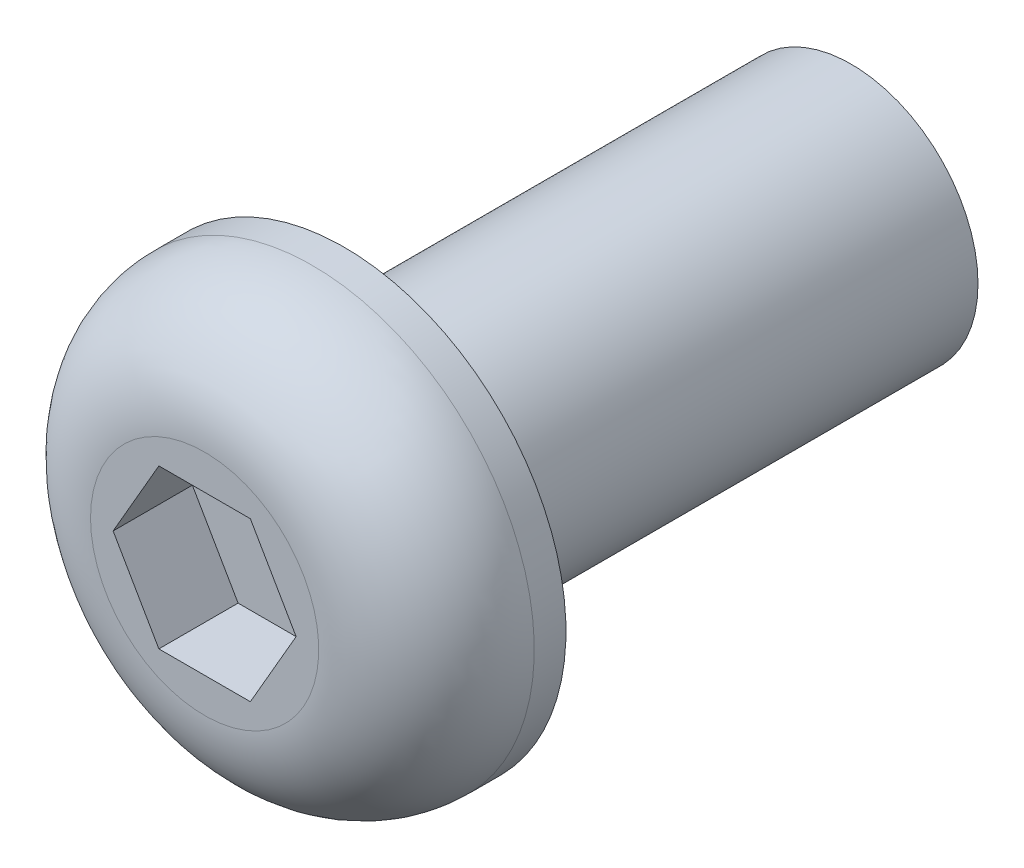
ISO-10303-21;
HEADER;
FILE_DESCRIPTION(('STEP AP214'),'2;1');
FILE_NAME('part.step','',(''),(''),'','','');
FILE_SCHEMA(('AUTOMOTIVE_DESIGN { 1 0 10303 214 1 1 1 1 }'));
ENDSEC;
DATA;
#1=APPLICATION_CONTEXT('core data for automotive mechanical design processes');
#2=APPLICATION_PROTOCOL_DEFINITION('international standard','automotive_design',2000,#1);
#3=PRODUCT_CONTEXT('',#1,'mechanical');
#4=PRODUCT('Part','Part','',(#3));
#5=PRODUCT_RELATED_PRODUCT_CATEGORY('part','',(#4));
#6=PRODUCT_DEFINITION_FORMATION('','',#4);
#7=PRODUCT_DEFINITION_CONTEXT('part definition',#1,'design');
#8=PRODUCT_DEFINITION('design','',#6,#7);
#9=PRODUCT_DEFINITION_SHAPE('','',#8);
#10=(LENGTH_UNIT() NAMED_UNIT(*) SI_UNIT(.MILLI.,.METRE.));
#11=(NAMED_UNIT(*) PLANE_ANGLE_UNIT() SI_UNIT($,.RADIAN.));
#12=(NAMED_UNIT(*) SI_UNIT($,.STERADIAN.) SOLID_ANGLE_UNIT());
#13=UNCERTAINTY_MEASURE_WITH_UNIT(LENGTH_MEASURE(1.E-05),#10,'distance_accuracy_value','');
#14=(GEOMETRIC_REPRESENTATION_CONTEXT(3) GLOBAL_UNCERTAINTY_ASSIGNED_CONTEXT((#13)) GLOBAL_UNIT_ASSIGNED_CONTEXT((#10,
#11,#12)) REPRESENTATION_CONTEXT('',''));
#15=CARTESIAN_POINT('',(0.,0.,0.));
#16=DIRECTION('',(0.,0.,1.));
#17=DIRECTION('',(1.,0.,0.));
#18=AXIS2_PLACEMENT_3D('',#15,#16,#17);
#19=CARTESIAN_POINT('',(0.,0.,-16.));
#20=DIRECTION('',(0.,0.,1.));
#21=DIRECTION('',(1.,0.,0.));
#22=AXIS2_PLACEMENT_3D('',#19,#20,#21);
#23=CYLINDRICAL_SURFACE('',#22,4.);
#24=CARTESIAN_POINT('',(0.,0.,-16.));
#25=DIRECTION('',(0.,0.,1.));
#26=DIRECTION('',(1.,0.,0.));
#27=AXIS2_PLACEMENT_3D('',#24,#25,#26);
#28=CIRCLE('',#27,4.);
#29=CARTESIAN_POINT('',(4.,0.,-16.));
#30=VERTEX_POINT('',#29);
#31=EDGE_CURVE('E11',#30,#30,#28,.T.);
#32=ORIENTED_EDGE('',*,*,#31,.T.);
#33=EDGE_LOOP('',(#32));
#34=FACE_BOUND('',#33,.T.);
#35=CARTESIAN_POINT('',(0.,0.,0.));
#36=DIRECTION('',(0.,0.,1.));
#37=DIRECTION('',(1.,0.,0.));
#38=AXIS2_PLACEMENT_3D('',#35,#36,#37);
#39=CIRCLE('',#38,4.);
#40=CARTESIAN_POINT('',(4.,0.,0.));
#41=VERTEX_POINT('',#40);
#42=EDGE_CURVE('E39',#41,#41,#39,.T.);
#43=ORIENTED_EDGE('',*,*,#42,.F.);
#44=EDGE_LOOP('',(#43));
#45=FACE_BOUND('',#44,.T.);
#46=ADVANCED_FACE('F36',(#34,#45),#23,.T.);
#47=CARTESIAN_POINT('',(0.,0.,-16.));
#48=DIRECTION('',(0.,0.,1.));
#49=DIRECTION('',(1.,0.,0.));
#50=AXIS2_PLACEMENT_3D('',#47,#48,#49);
#51=PLANE('',#50);
#52=ORIENTED_EDGE('',*,*,#31,.F.);
#53=EDGE_LOOP('',(#52));
#54=FACE_BOUND('',#53,.T.);
#55=ADVANCED_FACE('F169',(#54),#51,.F.);
#56=CARTESIAN_POINT('',(0.,0.,4.39999999999999));
#57=DIRECTION('',(0.,0.,1.));
#58=DIRECTION('',(1.,0.,0.));
#59=AXIS2_PLACEMENT_3D('',#56,#57,#58);
#60=PLANE('',#59);
#61=DIRECTION('',(-1.,0.,0.));
#62=VECTOR('',#61,1.);
#63=CARTESIAN_POINT('',(1.44337567297406,2.49999999999995,4.39999999999999));
#64=LINE('',#63,#62);
#65=CARTESIAN_POINT('',(1.44337567297406,2.49999999999995,4.39999999999999));
#66=VERTEX_POINT('',#65);
#67=CARTESIAN_POINT('',(-1.44337567297406,2.49999999999995,4.39999999999999));
#68=VERTEX_POINT('',#67);
#69=EDGE_CURVE('E51',#66,#68,#64,.T.);
#70=ORIENTED_EDGE('',*,*,#69,.F.);
#71=DIRECTION('',(-0.5,0.866025403784439,0.));
#72=VECTOR('',#71,1.);
#73=CARTESIAN_POINT('',(2.88675134594812,0.,4.39999999999999));
#74=LINE('',#73,#72);
#75=CARTESIAN_POINT('',(2.88675134594812,0.,4.39999999999999));
#76=VERTEX_POINT('',#75);
#77=EDGE_CURVE('E135',#76,#66,#74,.T.);
#78=ORIENTED_EDGE('',*,*,#77,.F.);
#79=DIRECTION('',(0.5,0.866025403784438,0.));
#80=VECTOR('',#79,1.);
#81=CARTESIAN_POINT('',(1.44337567297406,-2.49999999999995,4.39999999999999));
#82=LINE('',#81,#80);
#83=CARTESIAN_POINT('',(1.44337567297406,-2.49999999999995,4.39999999999999));
#84=VERTEX_POINT('',#83);
#85=EDGE_CURVE('E133',#84,#76,#82,.T.);
#86=ORIENTED_EDGE('',*,*,#85,.F.);
#87=DIRECTION('',(1.,0.,0.));
#88=VECTOR('',#87,1.);
#89=CARTESIAN_POINT('',(-1.44337567297406,-2.49999999999995,4.39999999999999));
#90=LINE('',#89,#88);
#91=CARTESIAN_POINT('',(-1.44337567297406,-2.49999999999995,4.39999999999999));
#92=VERTEX_POINT('',#91);
#93=EDGE_CURVE('E99',#92,#84,#90,.T.);
#94=ORIENTED_EDGE('',*,*,#93,.F.);
#95=DIRECTION('',(0.5,-0.866025403784439,0.));
#96=VECTOR('',#95,1.);
#97=CARTESIAN_POINT('',(-2.88675134594812,0.,4.39999999999999));
#98=LINE('',#97,#96);
#99=CARTESIAN_POINT('',(-2.88675134594812,0.,4.39999999999999));
#100=VERTEX_POINT('',#99);
#101=EDGE_CURVE('E128',#100,#92,#98,.T.);
#102=ORIENTED_EDGE('',*,*,#101,.F.);
#103=DIRECTION('',(-0.5,-0.866025403784439,0.));
#104=VECTOR('',#103,1.);
#105=CARTESIAN_POINT('',(-1.44337567297406,2.49999999999995,4.39999999999999));
#106=LINE('',#105,#104);
#107=EDGE_CURVE('E125',#68,#100,#106,.T.);
#108=ORIENTED_EDGE('',*,*,#107,.F.);
#109=EDGE_LOOP('',(#70,#78,#86,#94,#102,#108));
#110=FACE_BOUND('',#109,.T.);
#111=CARTESIAN_POINT('',(0.,0.,4.39999999999999));
#112=DIRECTION('',(0.,0.,-1.));
#113=DIRECTION('',(-1.,0.,0.));
#114=AXIS2_PLACEMENT_3D('',#111,#112,#113);
#115=CIRCLE('',#114,3.6);
#116=CARTESIAN_POINT('',(-3.6,0.,4.39999999999999));
#117=VERTEX_POINT('',#116);
#118=EDGE_CURVE('E152',#117,#117,#115,.T.);
#119=ORIENTED_EDGE('',*,*,#118,.F.);
#120=EDGE_LOOP('',(#119));
#121=FACE_BOUND('',#120,.T.);
#122=ADVANCED_FACE('F173',(#110,#121),#60,.T.);
#123=CARTESIAN_POINT('',(0.,0.,1.));
#124=DIRECTION('',(0.,0.,-1.));
#125=DIRECTION('',(-1.,0.,0.));
#126=AXIS2_PLACEMENT_3D('',#123,#124,#125);
#127=TOROIDAL_SURFACE('',#126,3.6,3.4);
#128=ORIENTED_EDGE('',*,*,#118,.T.);
#129=EDGE_LOOP('',(#128));
#130=FACE_BOUND('',#129,.T.);
#131=CARTESIAN_POINT('',(0.,0.,1.));
#132=DIRECTION('',(0.,0.,-1.));
#133=DIRECTION('',(-1.,0.,0.));
#134=AXIS2_PLACEMENT_3D('',#131,#132,#133);
#135=CIRCLE('',#134,7.);
#136=CARTESIAN_POINT('',(-7.,0.,1.));
#137=VERTEX_POINT('',#136);
#138=EDGE_CURVE('E148',#137,#137,#135,.T.);
#139=ORIENTED_EDGE('',*,*,#138,.F.);
#140=EDGE_LOOP('',(#139));
#141=FACE_BOUND('',#140,.T.);
#142=ADVANCED_FACE('F179',(#130,#141),#127,.T.);
#143=CARTESIAN_POINT('',(0.,0.,0.));
#144=DIRECTION('',(0.,0.,-1.));
#145=DIRECTION('',(-1.,0.,0.));
#146=AXIS2_PLACEMENT_3D('',#143,#144,#145);
#147=CYLINDRICAL_SURFACE('',#146,7.);
#148=ORIENTED_EDGE('',*,*,#138,.T.);
#149=EDGE_LOOP('',(#148));
#150=FACE_BOUND('',#149,.T.);
#151=CARTESIAN_POINT('',(0.,0.,0.));
#152=DIRECTION('',(0.,0.,-1.));
#153=DIRECTION('',(-1.,0.,0.));
#154=AXIS2_PLACEMENT_3D('',#151,#152,#153);
#155=CIRCLE('',#154,7.);
#156=CARTESIAN_POINT('',(-7.,0.,0.));
#157=VERTEX_POINT('',#156);
#158=EDGE_CURVE('E139',#157,#157,#155,.T.);
#159=ORIENTED_EDGE('',*,*,#158,.F.);
#160=EDGE_LOOP('',(#159));
#161=FACE_BOUND('',#160,.T.);
#162=ADVANCED_FACE('F185',(#150,#161),#147,.T.);
#163=CARTESIAN_POINT('',(0.,0.,0.));
#164=DIRECTION('',(0.,0.,-1.));
#165=DIRECTION('',(-1.,0.,0.));
#166=AXIS2_PLACEMENT_3D('',#163,#164,#165);
#167=PLANE('',#166);
#168=ORIENTED_EDGE('',*,*,#42,.T.);
#169=EDGE_LOOP('',(#168));
#170=FACE_BOUND('',#169,.T.);
#171=ORIENTED_EDGE('',*,*,#158,.T.);
#172=EDGE_LOOP('',(#171));
#173=FACE_BOUND('',#172,.T.);
#174=ADVANCED_FACE('F165',(#170,#173),#167,.T.);
#175=CARTESIAN_POINT('',(1.44337567297406,2.49999999999995,1.90000000000001));
#176=DIRECTION('',(0.,1.,0.));
#177=DIRECTION('',(0.,0.,1.));
#178=AXIS2_PLACEMENT_3D('',#175,#176,#177);
#179=PLANE('',#178);
#180=ORIENTED_EDGE('',*,*,#69,.T.);
#181=DIRECTION('',(0.,0.,1.));
#182=VECTOR('',#181,1.);
#183=CARTESIAN_POINT('',(-1.44337567297406,2.49999999999995,1.90000000000001));
#184=LINE('',#183,#182);
#185=CARTESIAN_POINT('',(-1.44337567297406,2.49999999999995,1.90000000000001));
#186=VERTEX_POINT('',#185);
#187=EDGE_CURVE('E81',#186,#68,#184,.T.);
#188=ORIENTED_EDGE('',*,*,#187,.F.);
#189=DIRECTION('',(-1.,0.,0.));
#190=VECTOR('',#189,1.);
#191=CARTESIAN_POINT('',(1.44337567297406,2.49999999999995,1.90000000000001));
#192=LINE('',#191,#190);
#193=CARTESIAN_POINT('',(1.44337567297406,2.49999999999995,1.90000000000001));
#194=VERTEX_POINT('',#193);
#195=EDGE_CURVE('E137',#194,#186,#192,.T.);
#196=ORIENTED_EDGE('',*,*,#195,.F.);
#197=DIRECTION('',(0.,0.,1.));
#198=VECTOR('',#197,1.);
#199=CARTESIAN_POINT('',(1.44337567297406,2.49999999999995,1.90000000000001));
#200=LINE('',#199,#198);
#201=EDGE_CURVE('E59',#194,#66,#200,.T.);
#202=ORIENTED_EDGE('',*,*,#201,.T.);
#203=EDGE_LOOP('',(#180,#188,#196,#202));
#204=FACE_BOUND('',#203,.T.);
#205=ADVANCED_FACE('F191',(#204),#179,.F.);
#206=CARTESIAN_POINT('',(2.88675134594812,0.,1.90000000000001));
#207=DIRECTION('',(0.866025403784439,0.5,0.));
#208=DIRECTION('',(-0.5,0.866025403784439,0.));
#209=AXIS2_PLACEMENT_3D('',#206,#207,#208);
#210=PLANE('',#209);
#211=ORIENTED_EDGE('',*,*,#77,.T.);
#212=ORIENTED_EDGE('',*,*,#201,.F.);
#213=DIRECTION('',(-0.5,0.866025403784439,0.));
#214=VECTOR('',#213,1.);
#215=CARTESIAN_POINT('',(2.88675134594812,0.,1.90000000000001));
#216=LINE('',#215,#214);
#217=CARTESIAN_POINT('',(2.88675134594812,0.,1.90000000000001));
#218=VERTEX_POINT('',#217);
#219=EDGE_CURVE('E111',#218,#194,#216,.T.);
#220=ORIENTED_EDGE('',*,*,#219,.F.);
#221=DIRECTION('',(0.,0.,1.));
#222=VECTOR('',#221,1.);
#223=CARTESIAN_POINT('',(2.88675134594812,0.,1.90000000000001));
#224=LINE('',#223,#222);
#225=EDGE_CURVE('E103',#218,#76,#224,.T.);
#226=ORIENTED_EDGE('',*,*,#225,.T.);
#227=EDGE_LOOP('',(#211,#212,#220,#226));
#228=FACE_BOUND('',#227,.T.);
#229=ADVANCED_FACE('F194',(#228),#210,.F.);
#230=CARTESIAN_POINT('',(1.44337567297406,-2.49999999999995,1.90000000000001));
#231=DIRECTION('',(0.866025403784439,-0.5,0.));
#232=DIRECTION('',(0.5,0.866025403784439,0.));
#233=AXIS2_PLACEMENT_3D('',#230,#231,#232);
#234=PLANE('',#233);
#235=ORIENTED_EDGE('',*,*,#85,.T.);
#236=ORIENTED_EDGE('',*,*,#225,.F.);
#237=DIRECTION('',(0.5,0.866025403784438,0.));
#238=VECTOR('',#237,1.);
#239=CARTESIAN_POINT('',(1.44337567297406,-2.49999999999995,1.90000000000001));
#240=LINE('',#239,#238);
#241=CARTESIAN_POINT('',(1.44337567297406,-2.49999999999995,1.90000000000001));
#242=VERTEX_POINT('',#241);
#243=EDGE_CURVE('E107',#242,#218,#240,.T.);
#244=ORIENTED_EDGE('',*,*,#243,.F.);
#245=DIRECTION('',(0.,0.,1.));
#246=VECTOR('',#245,1.);
#247=CARTESIAN_POINT('',(1.44337567297406,-2.49999999999995,1.90000000000001));
#248=LINE('',#247,#246);
#249=EDGE_CURVE('E92',#242,#84,#248,.T.);
#250=ORIENTED_EDGE('',*,*,#249,.T.);
#251=EDGE_LOOP('',(#235,#236,#244,#250));
#252=FACE_BOUND('',#251,.T.);
#253=ADVANCED_FACE('F108',(#252),#234,.F.);
#254=CARTESIAN_POINT('',(-1.44337567297406,-2.49999999999995,1.90000000000001));
#255=DIRECTION('',(0.,-1.,0.));
#256=DIRECTION('',(0.,0.,-1.));
#257=AXIS2_PLACEMENT_3D('',#254,#255,#256);
#258=PLANE('',#257);
#259=ORIENTED_EDGE('',*,*,#93,.T.);
#260=ORIENTED_EDGE('',*,*,#249,.F.);
#261=DIRECTION('',(1.,0.,0.));
#262=VECTOR('',#261,1.);
#263=CARTESIAN_POINT('',(-1.44337567297406,-2.49999999999995,1.90000000000001));
#264=LINE('',#263,#262);
#265=CARTESIAN_POINT('',(-1.44337567297406,-2.49999999999995,1.90000000000001));
#266=VERTEX_POINT('',#265);
#267=EDGE_CURVE('E96',#266,#242,#264,.T.);
#268=ORIENTED_EDGE('',*,*,#267,.F.);
#269=DIRECTION('',(0.,0.,1.));
#270=VECTOR('',#269,1.);
#271=CARTESIAN_POINT('',(-1.44337567297406,-2.49999999999995,1.90000000000001));
#272=LINE('',#271,#270);
#273=EDGE_CURVE('E104',#266,#92,#272,.T.);
#274=ORIENTED_EDGE('',*,*,#273,.T.);
#275=EDGE_LOOP('',(#259,#260,#268,#274));
#276=FACE_BOUND('',#275,.T.);
#277=ADVANCED_FACE('F94',(#276),#258,.F.);
#278=CARTESIAN_POINT('',(-2.88675134594812,0.,1.90000000000001));
#279=DIRECTION('',(-0.866025403784439,-0.5,0.));
#280=DIRECTION('',(0.5,-0.866025403784439,0.));
#281=AXIS2_PLACEMENT_3D('',#278,#279,#280);
#282=PLANE('',#281);
#283=ORIENTED_EDGE('',*,*,#101,.T.);
#284=ORIENTED_EDGE('',*,*,#273,.F.);
#285=DIRECTION('',(0.5,-0.866025403784439,0.));
#286=VECTOR('',#285,1.);
#287=CARTESIAN_POINT('',(-2.88675134594812,0.,1.90000000000001));
#288=LINE('',#287,#286);
#289=CARTESIAN_POINT('',(-2.88675134594812,0.,1.90000000000001));
#290=VERTEX_POINT('',#289);
#291=EDGE_CURVE('E117',#290,#266,#288,.T.);
#292=ORIENTED_EDGE('',*,*,#291,.F.);
#293=DIRECTION('',(0.,0.,1.));
#294=VECTOR('',#293,1.);
#295=CARTESIAN_POINT('',(-2.88675134594812,0.,1.90000000000001));
#296=LINE('',#295,#294);
#297=EDGE_CURVE('E142',#290,#100,#296,.T.);
#298=ORIENTED_EDGE('',*,*,#297,.T.);
#299=EDGE_LOOP('',(#283,#284,#292,#298));
#300=FACE_BOUND('',#299,.T.);
#301=ADVANCED_FACE('F198',(#300),#282,.F.);
#302=CARTESIAN_POINT('',(-1.44337567297406,2.49999999999995,1.90000000000001));
#303=DIRECTION('',(-0.866025403784438,0.5,0.));
#304=DIRECTION('',(-0.5,-0.866025403784439,0.));
#305=AXIS2_PLACEMENT_3D('',#302,#303,#304);
#306=PLANE('',#305);
#307=ORIENTED_EDGE('',*,*,#107,.T.);
#308=ORIENTED_EDGE('',*,*,#297,.F.);
#309=DIRECTION('',(-0.5,-0.866025403784439,0.));
#310=VECTOR('',#309,1.);
#311=CARTESIAN_POINT('',(-1.44337567297406,2.49999999999995,1.90000000000001));
#312=LINE('',#311,#310);
#313=EDGE_CURVE('E119',#186,#290,#312,.T.);
#314=ORIENTED_EDGE('',*,*,#313,.F.);
#315=ORIENTED_EDGE('',*,*,#187,.T.);
#316=EDGE_LOOP('',(#307,#308,#314,#315));
#317=FACE_BOUND('',#316,.T.);
#318=ADVANCED_FACE('F195',(#317),#306,.F.);
#319=CARTESIAN_POINT('',(-4.33012701892219,2.49999999999995,1.90000000000001));
#320=DIRECTION('',(0.,0.,1.));
#321=DIRECTION('',(1.,0.,0.));
#322=AXIS2_PLACEMENT_3D('',#319,#320,#321);
#323=PLANE('',#322);
#324=ORIENTED_EDGE('',*,*,#195,.T.);
#325=ORIENTED_EDGE('',*,*,#313,.T.);
#326=ORIENTED_EDGE('',*,*,#291,.T.);
#327=ORIENTED_EDGE('',*,*,#267,.T.);
#328=ORIENTED_EDGE('',*,*,#243,.T.);
#329=ORIENTED_EDGE('',*,*,#219,.T.);
#330=EDGE_LOOP('',(#324,#325,#326,#327,#328,#329));
#331=FACE_BOUND('',#330,.T.);
#332=ADVANCED_FACE('F114',(#331),#323,.T.);
#333=CLOSED_SHELL('',(#46,#55,#122,#142,#162,#174,#205,#229,#253,#277,#301,#318,#332));
#334=MANIFOLD_SOLID_BREP('B2',#333);
#335=ADVANCED_BREP_SHAPE_REPRESENTATION('',(#18,#334),#14);
#336=SHAPE_DEFINITION_REPRESENTATION(#9,#335);
ENDSEC;
END-ISO-10303-21;
